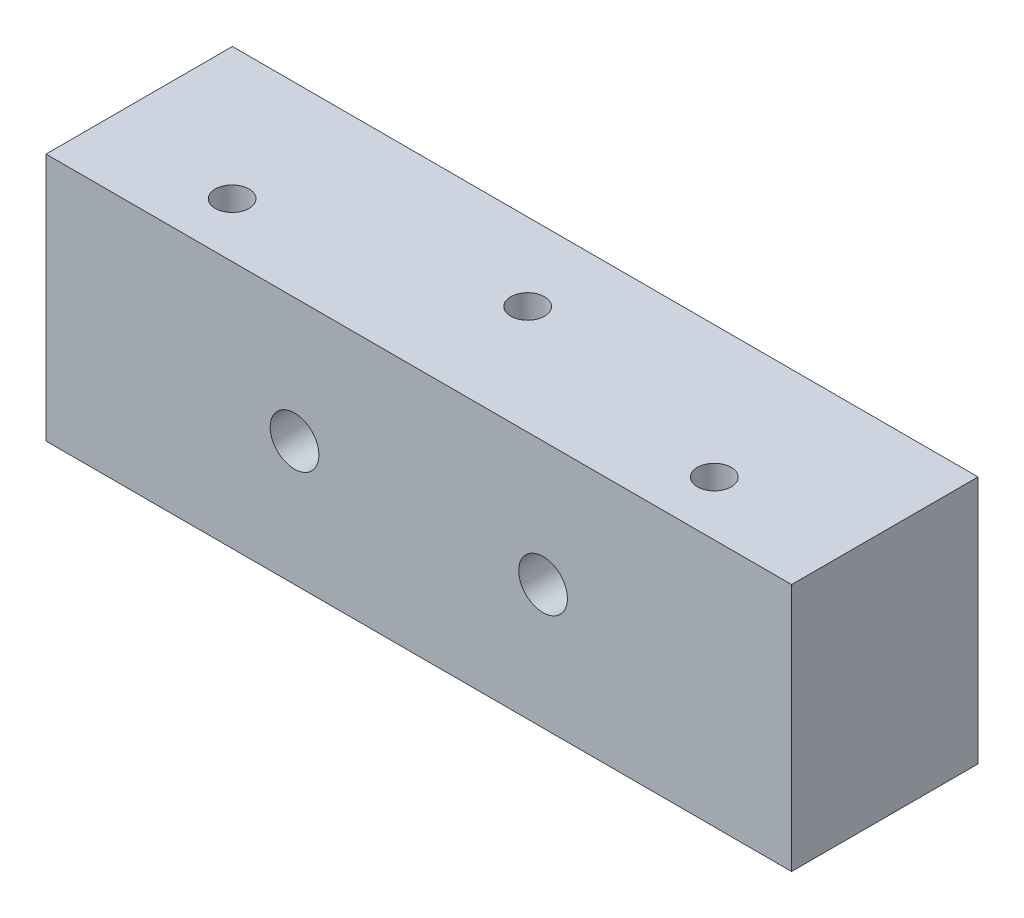
ISO-10303-21;
HEADER;
FILE_DESCRIPTION(('STEP AP214'),'2;1');
FILE_NAME('part.step','',(''),(''),'','','');
FILE_SCHEMA(('AUTOMOTIVE_DESIGN { 1 0 10303 214 1 1 1 1 }'));
ENDSEC;
DATA;
#1=APPLICATION_CONTEXT('core data for automotive mechanical design processes');
#2=APPLICATION_PROTOCOL_DEFINITION('international standard','automotive_design',2000,#1);
#3=PRODUCT_CONTEXT('',#1,'mechanical');
#4=PRODUCT('Part','Part','',(#3));
#5=PRODUCT_RELATED_PRODUCT_CATEGORY('part','',(#4));
#6=PRODUCT_DEFINITION_FORMATION('','',#4);
#7=PRODUCT_DEFINITION_CONTEXT('part definition',#1,'design');
#8=PRODUCT_DEFINITION('design','',#6,#7);
#9=PRODUCT_DEFINITION_SHAPE('','',#8);
#10=(LENGTH_UNIT() NAMED_UNIT(*) SI_UNIT(.MILLI.,.METRE.));
#11=(NAMED_UNIT(*) PLANE_ANGLE_UNIT() SI_UNIT($,.RADIAN.));
#12=(NAMED_UNIT(*) SI_UNIT($,.STERADIAN.) SOLID_ANGLE_UNIT());
#13=UNCERTAINTY_MEASURE_WITH_UNIT(LENGTH_MEASURE(1.E-05),#10,'distance_accuracy_value','');
#14=(GEOMETRIC_REPRESENTATION_CONTEXT(3) GLOBAL_UNCERTAINTY_ASSIGNED_CONTEXT((#13)) GLOBAL_UNIT_ASSIGNED_CONTEXT((#10,
#11,#12)) REPRESENTATION_CONTEXT('',''));
#15=CARTESIAN_POINT('',(0.,0.,0.));
#16=DIRECTION('',(0.,0.,1.));
#17=DIRECTION('',(1.,0.,0.));
#18=AXIS2_PLACEMENT_3D('',#15,#16,#17);
#19=CARTESIAN_POINT('',(38.1,12.7,9.525));
#20=DIRECTION('',(-1.,0.,0.));
#21=DIRECTION('',(0.,0.,1.));
#22=AXIS2_PLACEMENT_3D('',#19,#20,#21);
#23=PLANE('',#22);
#24=DIRECTION('',(0.,0.,-1.));
#25=VECTOR('',#24,1.);
#26=CARTESIAN_POINT('',(38.1,-12.7,9.525));
#27=LINE('',#26,#25);
#28=CARTESIAN_POINT('',(38.1,-12.7,9.525));
#29=VERTEX_POINT('',#28);
#30=CARTESIAN_POINT('',(38.1,-12.7,-9.525));
#31=VERTEX_POINT('',#30);
#32=EDGE_CURVE('E101',#29,#31,#27,.T.);
#33=ORIENTED_EDGE('',*,*,#32,.T.);
#34=DIRECTION('',(0.,-1.,0.));
#35=VECTOR('',#34,1.);
#36=CARTESIAN_POINT('',(38.1,12.7,-9.525));
#37=LINE('',#36,#35);
#38=CARTESIAN_POINT('',(38.1,12.7,-9.525));
#39=VERTEX_POINT('',#38);
#40=EDGE_CURVE('E11',#39,#31,#37,.T.);
#41=ORIENTED_EDGE('',*,*,#40,.F.);
#42=DIRECTION('',(0.,0.,-1.));
#43=VECTOR('',#42,1.);
#44=CARTESIAN_POINT('',(38.1,12.7,9.525));
#45=LINE('',#44,#43);
#46=CARTESIAN_POINT('',(38.1,12.7,9.525));
#47=VERTEX_POINT('',#46);
#48=EDGE_CURVE('E89',#47,#39,#45,.T.);
#49=ORIENTED_EDGE('',*,*,#48,.F.);
#50=DIRECTION('',(0.,-1.,0.));
#51=VECTOR('',#50,1.);
#52=CARTESIAN_POINT('',(38.1,12.7,9.525));
#53=LINE('',#52,#51);
#54=EDGE_CURVE('E97',#47,#29,#53,.T.);
#55=ORIENTED_EDGE('',*,*,#54,.T.);
#56=EDGE_LOOP('',(#33,#41,#49,#55));
#57=FACE_BOUND('',#56,.T.);
#58=ADVANCED_FACE('F38',(#57),#23,.F.);
#59=CARTESIAN_POINT('',(-38.1,12.7,-9.525));
#60=DIRECTION('',(0.,0.,1.));
#61=DIRECTION('',(1.,0.,0.));
#62=AXIS2_PLACEMENT_3D('',#59,#60,#61);
#63=PLANE('',#62);
#64=CARTESIAN_POINT('',(12.7,0.,-9.525));
#65=DIRECTION('',(0.,0.,-1.));
#66=DIRECTION('',(-1.,0.,0.));
#67=AXIS2_PLACEMENT_3D('',#64,#65,#66);
#68=CIRCLE('',#67,2.4892);
#69=CARTESIAN_POINT('',(10.2108,0.,-9.525));
#70=VERTEX_POINT('',#69);
#71=EDGE_CURVE('E141',#70,#70,#68,.T.);
#72=ORIENTED_EDGE('',*,*,#71,.F.);
#73=EDGE_LOOP('',(#72));
#74=FACE_BOUND('',#73,.T.);
#75=CARTESIAN_POINT('',(-12.7,0.,-9.525));
#76=DIRECTION('',(0.,0.,-1.));
#77=DIRECTION('',(-1.,0.,0.));
#78=AXIS2_PLACEMENT_3D('',#75,#76,#77);
#79=CIRCLE('',#78,2.4892);
#80=CARTESIAN_POINT('',(-15.1892,0.,-9.525));
#81=VERTEX_POINT('',#80);
#82=EDGE_CURVE('E135',#81,#81,#79,.T.);
#83=ORIENTED_EDGE('',*,*,#82,.F.);
#84=EDGE_LOOP('',(#83));
#85=FACE_BOUND('',#84,.T.);
#86=DIRECTION('',(-1.,0.,0.));
#87=VECTOR('',#86,1.);
#88=CARTESIAN_POINT('',(-38.1,-12.7,-9.525));
#89=LINE('',#88,#87);
#90=CARTESIAN_POINT('',(-38.1,-12.7,-9.525));
#91=VERTEX_POINT('',#90);
#92=EDGE_CURVE('E93',#31,#91,#89,.T.);
#93=ORIENTED_EDGE('',*,*,#92,.T.);
#94=DIRECTION('',(0.,-1.,0.));
#95=VECTOR('',#94,1.);
#96=CARTESIAN_POINT('',(-38.1,12.7,-9.525));
#97=LINE('',#96,#95);
#98=CARTESIAN_POINT('',(-38.1,12.7,-9.525));
#99=VERTEX_POINT('',#98);
#100=EDGE_CURVE('E46',#99,#91,#97,.T.);
#101=ORIENTED_EDGE('',*,*,#100,.F.);
#102=DIRECTION('',(-1.,0.,0.));
#103=VECTOR('',#102,1.);
#104=CARTESIAN_POINT('',(-38.1,12.7,-9.525));
#105=LINE('',#104,#103);
#106=EDGE_CURVE('E84',#39,#99,#105,.T.);
#107=ORIENTED_EDGE('',*,*,#106,.F.);
#108=ORIENTED_EDGE('',*,*,#40,.T.);
#109=EDGE_LOOP('',(#93,#101,#107,#108));
#110=FACE_BOUND('',#109,.T.);
#111=ADVANCED_FACE('F92',(#74,#85,#110),#63,.F.);
#112=CARTESIAN_POINT('',(-38.1,12.7,9.525));
#113=DIRECTION('',(1.,0.,0.));
#114=DIRECTION('',(0.,0.,-1.));
#115=AXIS2_PLACEMENT_3D('',#112,#113,#114);
#116=PLANE('',#115);
#117=DIRECTION('',(0.,0.,1.));
#118=VECTOR('',#117,1.);
#119=CARTESIAN_POINT('',(-38.1,-12.7,9.525));
#120=LINE('',#119,#118);
#121=CARTESIAN_POINT('',(-38.1,-12.7,9.525));
#122=VERTEX_POINT('',#121);
#123=EDGE_CURVE('E71',#91,#122,#120,.T.);
#124=ORIENTED_EDGE('',*,*,#123,.T.);
#125=DIRECTION('',(0.,-1.,0.));
#126=VECTOR('',#125,1.);
#127=CARTESIAN_POINT('',(-38.1,12.7,9.525));
#128=LINE('',#127,#126);
#129=CARTESIAN_POINT('',(-38.1,12.7,9.525));
#130=VERTEX_POINT('',#129);
#131=EDGE_CURVE('E94',#130,#122,#128,.T.);
#132=ORIENTED_EDGE('',*,*,#131,.F.);
#133=DIRECTION('',(0.,0.,1.));
#134=VECTOR('',#133,1.);
#135=CARTESIAN_POINT('',(-38.1,12.7,9.525));
#136=LINE('',#135,#134);
#137=EDGE_CURVE('E87',#99,#130,#136,.T.);
#138=ORIENTED_EDGE('',*,*,#137,.F.);
#139=ORIENTED_EDGE('',*,*,#100,.T.);
#140=EDGE_LOOP('',(#124,#132,#138,#139));
#141=FACE_BOUND('',#140,.T.);
#142=ADVANCED_FACE('F95',(#141),#116,.F.);
#143=CARTESIAN_POINT('',(-38.1,12.7,9.525));
#144=DIRECTION('',(0.,0.,-1.));
#145=DIRECTION('',(-1.,0.,0.));
#146=AXIS2_PLACEMENT_3D('',#143,#144,#145);
#147=PLANE('',#146);
#148=CARTESIAN_POINT('',(12.7,0.,9.525));
#149=DIRECTION('',(0.,0.,-1.));
#150=DIRECTION('',(-1.,0.,0.));
#151=AXIS2_PLACEMENT_3D('',#148,#149,#150);
#152=CIRCLE('',#151,2.4892);
#153=CARTESIAN_POINT('',(10.2108,0.,9.525));
#154=VERTEX_POINT('',#153);
#155=EDGE_CURVE('E138',#154,#154,#152,.T.);
#156=ORIENTED_EDGE('',*,*,#155,.T.);
#157=EDGE_LOOP('',(#156));
#158=FACE_BOUND('',#157,.T.);
#159=CARTESIAN_POINT('',(-12.7,0.,9.525));
#160=DIRECTION('',(0.,0.,-1.));
#161=DIRECTION('',(-1.,0.,0.));
#162=AXIS2_PLACEMENT_3D('',#159,#160,#161);
#163=CIRCLE('',#162,2.4892);
#164=CARTESIAN_POINT('',(-15.1892,0.,9.525));
#165=VERTEX_POINT('',#164);
#166=EDGE_CURVE('E132',#165,#165,#163,.T.);
#167=ORIENTED_EDGE('',*,*,#166,.T.);
#168=EDGE_LOOP('',(#167));
#169=FACE_BOUND('',#168,.T.);
#170=DIRECTION('',(1.,0.,0.));
#171=VECTOR('',#170,1.);
#172=CARTESIAN_POINT('',(-38.1,-12.7,9.525));
#173=LINE('',#172,#171);
#174=EDGE_CURVE('E77',#122,#29,#173,.T.);
#175=ORIENTED_EDGE('',*,*,#174,.T.);
#176=ORIENTED_EDGE('',*,*,#54,.F.);
#177=DIRECTION('',(1.,0.,0.));
#178=VECTOR('',#177,1.);
#179=CARTESIAN_POINT('',(-38.1,12.7,9.525));
#180=LINE('',#179,#178);
#181=EDGE_CURVE('E54',#130,#47,#180,.T.);
#182=ORIENTED_EDGE('',*,*,#181,.F.);
#183=ORIENTED_EDGE('',*,*,#131,.T.);
#184=EDGE_LOOP('',(#175,#176,#182,#183));
#185=FACE_BOUND('',#184,.T.);
#186=ADVANCED_FACE('F109',(#158,#169,#185),#147,.F.);
#187=CARTESIAN_POINT('',(0.,12.7,0.));
#188=DIRECTION('',(0.,-1.,0.));
#189=DIRECTION('',(0.,0.,-1.));
#190=AXIS2_PLACEMENT_3D('',#187,#188,#189);
#191=PLANE('',#190);
#192=CARTESIAN_POINT('',(-24.6379999999998,12.7,3.9623999999999));
#193=DIRECTION('',(0.,-1.,0.));
#194=DIRECTION('',(0.,0.,-1.));
#195=AXIS2_PLACEMENT_3D('',#192,#193,#194);
#196=CIRCLE('',#195,1.72719999999999);
#197=CARTESIAN_POINT('',(-24.6379999999998,12.7,2.2351999999999));
#198=VERTEX_POINT('',#197);
#199=EDGE_CURVE('E126',#198,#198,#196,.T.);
#200=ORIENTED_EDGE('',*,*,#199,.T.);
#201=EDGE_LOOP('',(#200));
#202=FACE_BOUND('',#201,.T.);
#203=CARTESIAN_POINT('',(1.94812932688061E-13,12.7,-1.6002000000001));
#204=DIRECTION('',(0.,-1.,0.));
#205=DIRECTION('',(0.,0.,-1.));
#206=AXIS2_PLACEMENT_3D('',#203,#204,#205);
#207=CIRCLE('',#206,1.7272);
#208=CARTESIAN_POINT('',(1.94812932688061E-13,12.7,-3.3274000000001));
#209=VERTEX_POINT('',#208);
#210=EDGE_CURVE('E120',#209,#209,#207,.T.);
#211=ORIENTED_EDGE('',*,*,#210,.T.);
#212=EDGE_LOOP('',(#211));
#213=FACE_BOUND('',#212,.T.);
#214=CARTESIAN_POINT('',(24.6380000000002,12.7,3.9623999999999));
#215=DIRECTION('',(0.,-1.,0.));
#216=DIRECTION('',(0.,0.,-1.));
#217=AXIS2_PLACEMENT_3D('',#214,#215,#216);
#218=CIRCLE('',#217,1.72719999999999);
#219=CARTESIAN_POINT('',(24.6380000000002,12.7,2.2351999999999));
#220=VERTEX_POINT('',#219);
#221=EDGE_CURVE('E104',#220,#220,#218,.T.);
#222=ORIENTED_EDGE('',*,*,#221,.T.);
#223=EDGE_LOOP('',(#222));
#224=FACE_BOUND('',#223,.T.);
#225=ORIENTED_EDGE('',*,*,#48,.T.);
#226=ORIENTED_EDGE('',*,*,#106,.T.);
#227=ORIENTED_EDGE('',*,*,#137,.T.);
#228=ORIENTED_EDGE('',*,*,#181,.T.);
#229=EDGE_LOOP('',(#225,#226,#227,#228));
#230=FACE_BOUND('',#229,.T.);
#231=ADVANCED_FACE('F85',(#202,#213,#224,#230),#191,.F.);
#232=CARTESIAN_POINT('',(0.,-12.7,0.));
#233=DIRECTION('',(0.,-1.,0.));
#234=DIRECTION('',(0.,0.,-1.));
#235=AXIS2_PLACEMENT_3D('',#232,#233,#234);
#236=PLANE('',#235);
#237=CARTESIAN_POINT('',(-24.6379999999998,-12.7,3.9623999999999));
#238=DIRECTION('',(0.,-1.,0.));
#239=DIRECTION('',(0.,0.,-1.));
#240=AXIS2_PLACEMENT_3D('',#237,#238,#239);
#241=CIRCLE('',#240,1.72719999999999);
#242=CARTESIAN_POINT('',(-24.6379999999998,-12.7,2.23519999999991));
#243=VERTEX_POINT('',#242);
#244=EDGE_CURVE('E129',#243,#243,#241,.T.);
#245=ORIENTED_EDGE('',*,*,#244,.F.);
#246=EDGE_LOOP('',(#245));
#247=FACE_BOUND('',#246,.T.);
#248=CARTESIAN_POINT('',(1.94812932688061E-13,-12.7,-1.6002000000001));
#249=DIRECTION('',(0.,-1.,0.));
#250=DIRECTION('',(0.,0.,-1.));
#251=AXIS2_PLACEMENT_3D('',#248,#249,#250);
#252=CIRCLE('',#251,1.72719999999999);
#253=CARTESIAN_POINT('',(1.94812932688061E-13,-12.7,-3.32740000000009));
#254=VERTEX_POINT('',#253);
#255=EDGE_CURVE('E123',#254,#254,#252,.T.);
#256=ORIENTED_EDGE('',*,*,#255,.F.);
#257=EDGE_LOOP('',(#256));
#258=FACE_BOUND('',#257,.T.);
#259=CARTESIAN_POINT('',(24.6380000000002,-12.7,3.9623999999999));
#260=DIRECTION('',(0.,-1.,0.));
#261=DIRECTION('',(0.,0.,-1.));
#262=AXIS2_PLACEMENT_3D('',#259,#260,#261);
#263=CIRCLE('',#262,1.72719999999999);
#264=CARTESIAN_POINT('',(24.6380000000002,-12.7,2.23519999999991));
#265=VERTEX_POINT('',#264);
#266=EDGE_CURVE('E117',#265,#265,#263,.T.);
#267=ORIENTED_EDGE('',*,*,#266,.F.);
#268=EDGE_LOOP('',(#267));
#269=FACE_BOUND('',#268,.T.);
#270=ORIENTED_EDGE('',*,*,#32,.F.);
#271=ORIENTED_EDGE('',*,*,#174,.F.);
#272=ORIENTED_EDGE('',*,*,#123,.F.);
#273=ORIENTED_EDGE('',*,*,#92,.F.);
#274=EDGE_LOOP('',(#270,#271,#272,#273));
#275=FACE_BOUND('',#274,.T.);
#276=ADVANCED_FACE('F112',(#247,#258,#269,#275),#236,.T.);
#277=CARTESIAN_POINT('',(24.6380000000002,-12.7,3.9623999999999));
#278=DIRECTION('',(0.,-1.,0.));
#279=DIRECTION('',(0.,0.,-1.));
#280=AXIS2_PLACEMENT_3D('',#277,#278,#279);
#281=CYLINDRICAL_SURFACE('',#280,1.72719999999999);
#282=ORIENTED_EDGE('',*,*,#221,.F.);
#283=EDGE_LOOP('',(#282));
#284=FACE_BOUND('',#283,.T.);
#285=ORIENTED_EDGE('',*,*,#266,.T.);
#286=EDGE_LOOP('',(#285));
#287=FACE_BOUND('',#286,.T.);
#288=ADVANCED_FACE('F201',(#284,#287),#281,.F.);
#289=CARTESIAN_POINT('',(1.94812932688061E-13,-12.7,-1.6002000000001));
#290=DIRECTION('',(0.,-1.,0.));
#291=DIRECTION('',(0.,0.,-1.));
#292=AXIS2_PLACEMENT_3D('',#289,#290,#291);
#293=CYLINDRICAL_SURFACE('',#292,1.72719999999999);
#294=ORIENTED_EDGE('',*,*,#210,.F.);
#295=EDGE_LOOP('',(#294));
#296=FACE_BOUND('',#295,.T.);
#297=ORIENTED_EDGE('',*,*,#255,.T.);
#298=EDGE_LOOP('',(#297));
#299=FACE_BOUND('',#298,.T.);
#300=ADVANCED_FACE('F162',(#296,#299),#293,.F.);
#301=CARTESIAN_POINT('',(-24.6379999999998,-12.7,3.9623999999999));
#302=DIRECTION('',(0.,-1.,0.));
#303=DIRECTION('',(0.,0.,-1.));
#304=AXIS2_PLACEMENT_3D('',#301,#302,#303);
#305=CYLINDRICAL_SURFACE('',#304,1.72719999999999);
#306=ORIENTED_EDGE('',*,*,#199,.F.);
#307=EDGE_LOOP('',(#306));
#308=FACE_BOUND('',#307,.T.);
#309=ORIENTED_EDGE('',*,*,#244,.T.);
#310=EDGE_LOOP('',(#309));
#311=FACE_BOUND('',#310,.T.);
#312=ADVANCED_FACE('F153',(#308,#311),#305,.F.);
#313=CARTESIAN_POINT('',(-12.7,0.,-9.525));
#314=DIRECTION('',(0.,0.,-1.));
#315=DIRECTION('',(-1.,0.,0.));
#316=AXIS2_PLACEMENT_3D('',#313,#314,#315);
#317=CYLINDRICAL_SURFACE('',#316,2.4892);
#318=ORIENTED_EDGE('',*,*,#166,.F.);
#319=EDGE_LOOP('',(#318));
#320=FACE_BOUND('',#319,.T.);
#321=ORIENTED_EDGE('',*,*,#82,.T.);
#322=EDGE_LOOP('',(#321));
#323=FACE_BOUND('',#322,.T.);
#324=ADVANCED_FACE('F151',(#320,#323),#317,.F.);
#325=CARTESIAN_POINT('',(12.7,0.,-9.525));
#326=DIRECTION('',(0.,0.,-1.));
#327=DIRECTION('',(-1.,0.,0.));
#328=AXIS2_PLACEMENT_3D('',#325,#326,#327);
#329=CYLINDRICAL_SURFACE('',#328,2.4892);
#330=ORIENTED_EDGE('',*,*,#155,.F.);
#331=EDGE_LOOP('',(#330));
#332=FACE_BOUND('',#331,.T.);
#333=ORIENTED_EDGE('',*,*,#71,.T.);
#334=EDGE_LOOP('',(#333));
#335=FACE_BOUND('',#334,.T.);
#336=ADVANCED_FACE('F145',(#332,#335),#329,.F.);
#337=CLOSED_SHELL('',(#58,#111,#142,#186,#231,#276,#288,#300,#312,#324,#336));
#338=MANIFOLD_SOLID_BREP('B2',#337);
#339=ADVANCED_BREP_SHAPE_REPRESENTATION('',(#18,#338),#14);
#340=SHAPE_DEFINITION_REPRESENTATION(#9,#339);
ENDSEC;
END-ISO-10303-21;
